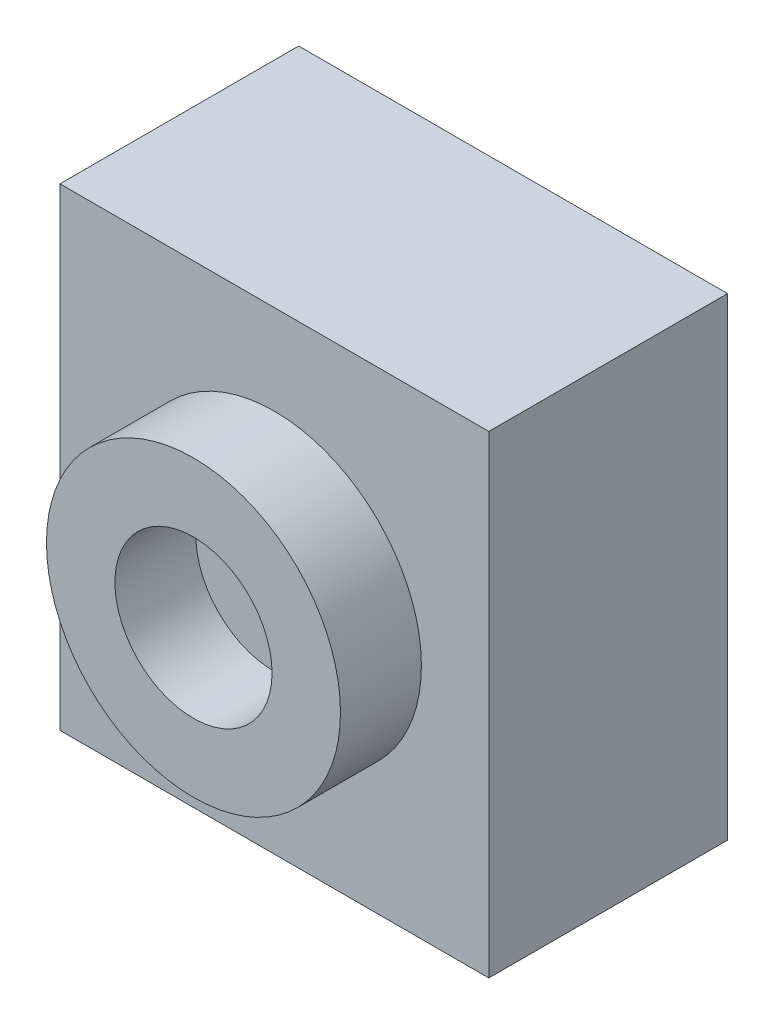
ISO-10303-21;
HEADER;
FILE_DESCRIPTION(('STEP AP214'),'2;1');
FILE_NAME('part.step','',(''),(''),'','','');
FILE_SCHEMA(('AUTOMOTIVE_DESIGN { 1 0 10303 214 1 1 1 1 }'));
ENDSEC;
DATA;
#1=APPLICATION_CONTEXT('core data for automotive mechanical design processes');
#2=APPLICATION_PROTOCOL_DEFINITION('international standard','automotive_design',2000,#1);
#3=PRODUCT_CONTEXT('',#1,'mechanical');
#4=PRODUCT('Part','Part','',(#3));
#5=PRODUCT_RELATED_PRODUCT_CATEGORY('part','',(#4));
#6=PRODUCT_DEFINITION_FORMATION('','',#4);
#7=PRODUCT_DEFINITION_CONTEXT('part definition',#1,'design');
#8=PRODUCT_DEFINITION('design','',#6,#7);
#9=PRODUCT_DEFINITION_SHAPE('','',#8);
#10=(LENGTH_UNIT() NAMED_UNIT(*) SI_UNIT(.MILLI.,.METRE.));
#11=(NAMED_UNIT(*) PLANE_ANGLE_UNIT() SI_UNIT($,.RADIAN.));
#12=(NAMED_UNIT(*) SI_UNIT($,.STERADIAN.) SOLID_ANGLE_UNIT());
#13=UNCERTAINTY_MEASURE_WITH_UNIT(LENGTH_MEASURE(1.E-05),#10,'distance_accuracy_value','');
#14=(GEOMETRIC_REPRESENTATION_CONTEXT(3) GLOBAL_UNCERTAINTY_ASSIGNED_CONTEXT((#13)) GLOBAL_UNIT_ASSIGNED_CONTEXT((#10,
#11,#12)) REPRESENTATION_CONTEXT('',''));
#15=CARTESIAN_POINT('',(0.,0.,0.));
#16=DIRECTION('',(0.,0.,1.));
#17=DIRECTION('',(1.,0.,0.));
#18=AXIS2_PLACEMENT_3D('',#15,#16,#17);
#19=CARTESIAN_POINT('',(-5.3,5.85,5.9));
#20=DIRECTION('',(1.,0.,0.));
#21=DIRECTION('',(0.,1.,0.));
#22=AXIS2_PLACEMENT_3D('',#19,#20,#21);
#23=PLANE('',#22);
#24=DIRECTION('',(0.,-1.,0.));
#25=VECTOR('',#24,1.);
#26=CARTESIAN_POINT('',(-5.3,5.85,0.));
#27=LINE('',#26,#25);
#28=CARTESIAN_POINT('',(-5.3,5.85,0.));
#29=VERTEX_POINT('',#28);
#30=CARTESIAN_POINT('',(-5.3,-5.85,0.));
#31=VERTEX_POINT('',#30);
#32=EDGE_CURVE('E99',#29,#31,#27,.T.);
#33=ORIENTED_EDGE('',*,*,#32,.T.);
#34=DIRECTION('',(0.,0.,-1.));
#35=VECTOR('',#34,1.);
#36=CARTESIAN_POINT('',(-5.3,-5.85,5.9));
#37=LINE('',#36,#35);
#38=CARTESIAN_POINT('',(-5.3,-5.85,5.9));
#39=VERTEX_POINT('',#38);
#40=EDGE_CURVE('E41',#39,#31,#37,.T.);
#41=ORIENTED_EDGE('',*,*,#40,.F.);
#42=DIRECTION('',(0.,-1.,0.));
#43=VECTOR('',#42,1.);
#44=CARTESIAN_POINT('',(-5.3,5.85,5.9));
#45=LINE('',#44,#43);
#46=CARTESIAN_POINT('',(-5.3,5.85,5.9));
#47=VERTEX_POINT('',#46);
#48=EDGE_CURVE('E85',#47,#39,#45,.T.);
#49=ORIENTED_EDGE('',*,*,#48,.F.);
#50=DIRECTION('',(0.,0.,-1.));
#51=VECTOR('',#50,1.);
#52=CARTESIAN_POINT('',(-5.3,5.85,5.9));
#53=LINE('',#52,#51);
#54=EDGE_CURVE('E95',#47,#29,#53,.T.);
#55=ORIENTED_EDGE('',*,*,#54,.T.);
#56=EDGE_LOOP('',(#33,#41,#49,#55));
#57=FACE_BOUND('',#56,.T.);
#58=ADVANCED_FACE('F33',(#57),#23,.F.);
#59=CARTESIAN_POINT('',(-5.3,-5.85,5.9));
#60=DIRECTION('',(0.,1.,0.));
#61=DIRECTION('',(-1.,0.,0.));
#62=AXIS2_PLACEMENT_3D('',#59,#60,#61);
#63=PLANE('',#62);
#64=DIRECTION('',(1.,0.,0.));
#65=VECTOR('',#64,1.);
#66=CARTESIAN_POINT('',(-5.3,-5.85,0.));
#67=LINE('',#66,#65);
#68=CARTESIAN_POINT('',(5.3,-5.85,0.));
#69=VERTEX_POINT('',#68);
#70=EDGE_CURVE('E90',#31,#69,#67,.T.);
#71=ORIENTED_EDGE('',*,*,#70,.T.);
#72=DIRECTION('',(0.,0.,-1.));
#73=VECTOR('',#72,1.);
#74=CARTESIAN_POINT('',(5.3,-5.85,5.9));
#75=LINE('',#74,#73);
#76=CARTESIAN_POINT('',(5.3,-5.85,5.9));
#77=VERTEX_POINT('',#76);
#78=EDGE_CURVE('E88',#77,#69,#75,.T.);
#79=ORIENTED_EDGE('',*,*,#78,.F.);
#80=DIRECTION('',(1.,0.,0.));
#81=VECTOR('',#80,1.);
#82=CARTESIAN_POINT('',(-5.3,-5.85,5.9));
#83=LINE('',#82,#81);
#84=EDGE_CURVE('E80',#39,#77,#83,.T.);
#85=ORIENTED_EDGE('',*,*,#84,.F.);
#86=ORIENTED_EDGE('',*,*,#40,.T.);
#87=EDGE_LOOP('',(#71,#79,#85,#86));
#88=FACE_BOUND('',#87,.T.);
#89=ADVANCED_FACE('F89',(#88),#63,.F.);
#90=CARTESIAN_POINT('',(5.3,5.85,5.9));
#91=DIRECTION('',(-1.,0.,0.));
#92=DIRECTION('',(0.,-1.,0.));
#93=AXIS2_PLACEMENT_3D('',#90,#91,#92);
#94=PLANE('',#93);
#95=DIRECTION('',(0.,1.,0.));
#96=VECTOR('',#95,1.);
#97=CARTESIAN_POINT('',(5.3,5.85,0.));
#98=LINE('',#97,#96);
#99=CARTESIAN_POINT('',(5.3,5.85,0.));
#100=VERTEX_POINT('',#99);
#101=EDGE_CURVE('E66',#69,#100,#98,.T.);
#102=ORIENTED_EDGE('',*,*,#101,.T.);
#103=DIRECTION('',(0.,0.,-1.));
#104=VECTOR('',#103,1.);
#105=CARTESIAN_POINT('',(5.3,5.85,5.9));
#106=LINE('',#105,#104);
#107=CARTESIAN_POINT('',(5.3,5.85,5.9));
#108=VERTEX_POINT('',#107);
#109=EDGE_CURVE('E91',#108,#100,#106,.T.);
#110=ORIENTED_EDGE('',*,*,#109,.F.);
#111=DIRECTION('',(0.,1.,0.));
#112=VECTOR('',#111,1.);
#113=CARTESIAN_POINT('',(5.3,5.85,5.9));
#114=LINE('',#113,#112);
#115=EDGE_CURVE('E83',#77,#108,#114,.T.);
#116=ORIENTED_EDGE('',*,*,#115,.F.);
#117=ORIENTED_EDGE('',*,*,#78,.T.);
#118=EDGE_LOOP('',(#102,#110,#116,#117));
#119=FACE_BOUND('',#118,.T.);
#120=ADVANCED_FACE('F93',(#119),#94,.F.);
#121=CARTESIAN_POINT('',(-5.3,5.85,5.9));
#122=DIRECTION('',(0.,-1.,0.));
#123=DIRECTION('',(1.,0.,0.));
#124=AXIS2_PLACEMENT_3D('',#121,#122,#123);
#125=PLANE('',#124);
#126=DIRECTION('',(-1.,0.,0.));
#127=VECTOR('',#126,1.);
#128=CARTESIAN_POINT('',(-5.3,5.85,0.));
#129=LINE('',#128,#127);
#130=EDGE_CURVE('E72',#100,#29,#129,.T.);
#131=ORIENTED_EDGE('',*,*,#130,.T.);
#132=ORIENTED_EDGE('',*,*,#54,.F.);
#133=DIRECTION('',(-1.,0.,0.));
#134=VECTOR('',#133,1.);
#135=CARTESIAN_POINT('',(-5.3,5.85,5.9));
#136=LINE('',#135,#134);
#137=EDGE_CURVE('E49',#108,#47,#136,.T.);
#138=ORIENTED_EDGE('',*,*,#137,.F.);
#139=ORIENTED_EDGE('',*,*,#109,.T.);
#140=EDGE_LOOP('',(#131,#132,#138,#139));
#141=FACE_BOUND('',#140,.T.);
#142=ADVANCED_FACE('F121',(#141),#125,.F.);
#143=CARTESIAN_POINT('',(0.,0.,5.9));
#144=DIRECTION('',(0.,0.,1.));
#145=DIRECTION('',(1.,0.,0.));
#146=AXIS2_PLACEMENT_3D('',#143,#144,#145);
#147=PLANE('',#146);
#148=CARTESIAN_POINT('',(0.,0.,5.9));
#149=DIRECTION('',(0.,0.,1.));
#150=DIRECTION('',(1.,0.,0.));
#151=AXIS2_PLACEMENT_3D('',#148,#149,#150);
#152=CIRCLE('',#151,3.63354623219278);
#153=CARTESIAN_POINT('',(3.63354623219278,0.,5.9));
#154=VERTEX_POINT('',#153);
#155=EDGE_CURVE('E190',#154,#154,#152,.T.);
#156=ORIENTED_EDGE('',*,*,#155,.F.);
#157=EDGE_LOOP('',(#156));
#158=FACE_BOUND('',#157,.T.);
#159=ORIENTED_EDGE('',*,*,#48,.T.);
#160=ORIENTED_EDGE('',*,*,#84,.T.);
#161=ORIENTED_EDGE('',*,*,#115,.T.);
#162=ORIENTED_EDGE('',*,*,#137,.T.);
#163=EDGE_LOOP('',(#159,#160,#161,#162));
#164=FACE_BOUND('',#163,.T.);
#165=ADVANCED_FACE('F81',(#158,#164),#147,.T.);
#166=CARTESIAN_POINT('',(0.,0.,0.));
#167=DIRECTION('',(0.,0.,1.));
#168=DIRECTION('',(1.,0.,0.));
#169=AXIS2_PLACEMENT_3D('',#166,#167,#168);
#170=PLANE('',#169);
#171=ORIENTED_EDGE('',*,*,#32,.F.);
#172=ORIENTED_EDGE('',*,*,#130,.F.);
#173=ORIENTED_EDGE('',*,*,#101,.F.);
#174=ORIENTED_EDGE('',*,*,#70,.F.);
#175=EDGE_LOOP('',(#171,#172,#173,#174));
#176=FACE_BOUND('',#175,.T.);
#177=ADVANCED_FACE('F110',(#176),#170,.F.);
#178=CARTESIAN_POINT('',(0.,0.,7.9));
#179=DIRECTION('',(0.,0.,1.));
#180=DIRECTION('',(1.,0.,0.));
#181=AXIS2_PLACEMENT_3D('',#178,#179,#180);
#182=PLANE('',#181);
#183=CARTESIAN_POINT('',(0.,0.,7.9));
#184=DIRECTION('',(0.,0.,1.));
#185=DIRECTION('',(1.,0.,0.));
#186=AXIS2_PLACEMENT_3D('',#183,#184,#185);
#187=CIRCLE('',#186,3.63354623219278);
#188=CARTESIAN_POINT('',(3.63354623219278,0.,7.9));
#189=VERTEX_POINT('',#188);
#190=EDGE_CURVE('E102',#189,#189,#187,.T.);
#191=ORIENTED_EDGE('',*,*,#190,.T.);
#192=EDGE_LOOP('',(#191));
#193=FACE_BOUND('',#192,.T.);
#194=CARTESIAN_POINT('',(0.,0.,7.9));
#195=DIRECTION('',(0.,0.,1.));
#196=DIRECTION('',(1.,0.,0.));
#197=AXIS2_PLACEMENT_3D('',#194,#195,#196);
#198=CIRCLE('',#197,1.94183562563513);
#199=CARTESIAN_POINT('',(1.94183562563513,0.,7.9));
#200=VERTEX_POINT('',#199);
#201=EDGE_CURVE('E188',#200,#200,#198,.T.);
#202=ORIENTED_EDGE('',*,*,#201,.F.);
#203=EDGE_LOOP('',(#202));
#204=FACE_BOUND('',#203,.T.);
#205=ADVANCED_FACE('F112',(#193,#204),#182,.T.);
#206=CARTESIAN_POINT('',(0.,0.,7.9));
#207=DIRECTION('',(0.,0.,-1.));
#208=DIRECTION('',(-1.,0.,0.));
#209=AXIS2_PLACEMENT_3D('',#206,#207,#208);
#210=CYLINDRICAL_SURFACE('',#209,3.63354623219278);
#211=ORIENTED_EDGE('',*,*,#190,.F.);
#212=EDGE_LOOP('',(#211));
#213=FACE_BOUND('',#212,.T.);
#214=ORIENTED_EDGE('',*,*,#155,.T.);
#215=EDGE_LOOP('',(#214));
#216=FACE_BOUND('',#215,.T.);
#217=ADVANCED_FACE('F118',(#213,#216),#210,.T.);
#218=CARTESIAN_POINT('',(0.,0.,7.9));
#219=DIRECTION('',(0.,0.,-1.));
#220=DIRECTION('',(-1.,0.,0.));
#221=AXIS2_PLACEMENT_3D('',#218,#219,#220);
#222=CYLINDRICAL_SURFACE('',#221,1.94183562563513);
#223=ORIENTED_EDGE('',*,*,#201,.T.);
#224=EDGE_LOOP('',(#223));
#225=FACE_BOUND('',#224,.T.);
#226=CARTESIAN_POINT('',(0.,0.,5.9));
#227=DIRECTION('',(0.,0.,1.));
#228=DIRECTION('',(1.,0.,0.));
#229=AXIS2_PLACEMENT_3D('',#226,#227,#228);
#230=CIRCLE('',#229,1.94183562563513);
#231=CARTESIAN_POINT('',(1.94183562563513,0.,5.9));
#232=VERTEX_POINT('',#231);
#233=EDGE_CURVE('E11',#232,#232,#230,.F.);
#234=ORIENTED_EDGE('',*,*,#233,.T.);
#235=EDGE_LOOP('',(#234));
#236=FACE_BOUND('',#235,.T.);
#237=ADVANCED_FACE('F161',(#225,#236),#222,.F.);
#238=ORIENTED_EDGE('',*,*,#233,.F.);
#239=EDGE_LOOP('',(#238));
#240=FACE_BOUND('',#239,.T.);
#241=ADVANCED_FACE('F124',(#240),#147,.T.);
#242=CLOSED_SHELL('',(#58,#89,#120,#142,#165,#177,#205,#217,#237,#241));
#243=MANIFOLD_SOLID_BREP('B2',#242);
#244=ADVANCED_BREP_SHAPE_REPRESENTATION('',(#18,#243),#14);
#245=SHAPE_DEFINITION_REPRESENTATION(#9,#244);
ENDSEC;
END-ISO-10303-21;
